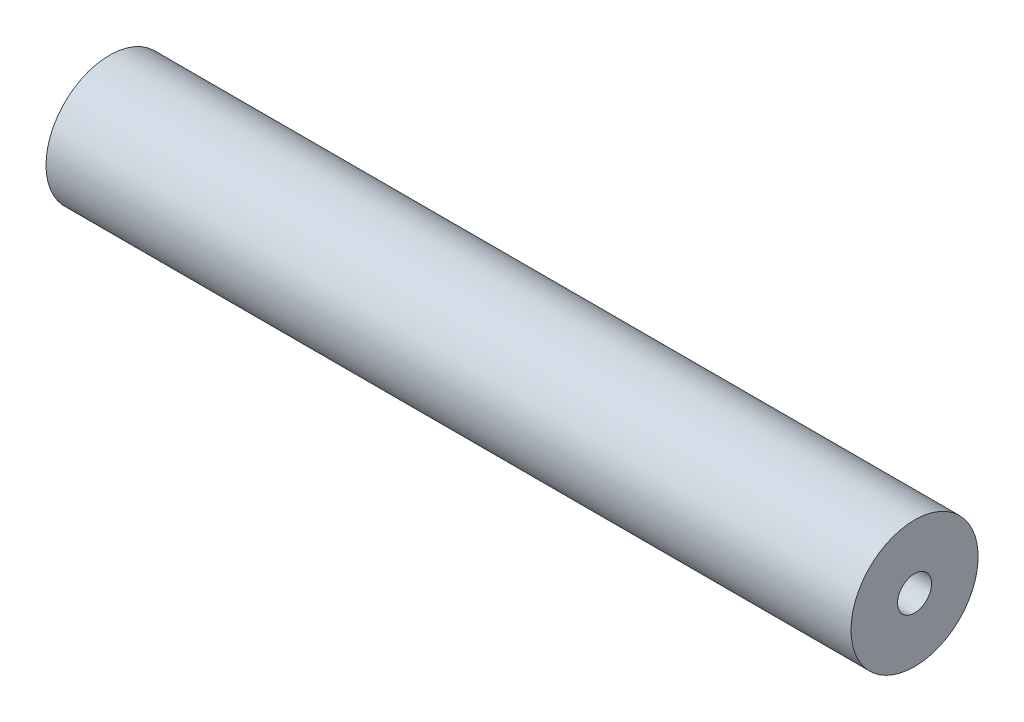
ISO-10303-21;
HEADER;
FILE_DESCRIPTION(('STEP AP214'),'2;1');
FILE_NAME('part.step','',(''),(''),'','','');
FILE_SCHEMA(('AUTOMOTIVE_DESIGN { 1 0 10303 214 1 1 1 1 }'));
ENDSEC;
DATA;
#1=APPLICATION_CONTEXT('core data for automotive mechanical design processes');
#2=APPLICATION_PROTOCOL_DEFINITION('international standard','automotive_design',2000,#1);
#3=PRODUCT_CONTEXT('',#1,'mechanical');
#4=PRODUCT('Part','Part','',(#3));
#5=PRODUCT_RELATED_PRODUCT_CATEGORY('part','',(#4));
#6=PRODUCT_DEFINITION_FORMATION('','',#4);
#7=PRODUCT_DEFINITION_CONTEXT('part definition',#1,'design');
#8=PRODUCT_DEFINITION('design','',#6,#7);
#9=PRODUCT_DEFINITION_SHAPE('','',#8);
#10=(LENGTH_UNIT() NAMED_UNIT(*) SI_UNIT(.MILLI.,.METRE.));
#11=(NAMED_UNIT(*) PLANE_ANGLE_UNIT() SI_UNIT($,.RADIAN.));
#12=(NAMED_UNIT(*) SI_UNIT($,.STERADIAN.) SOLID_ANGLE_UNIT());
#13=UNCERTAINTY_MEASURE_WITH_UNIT(LENGTH_MEASURE(1.E-05),#10,'distance_accuracy_value','');
#14=(GEOMETRIC_REPRESENTATION_CONTEXT(3) GLOBAL_UNCERTAINTY_ASSIGNED_CONTEXT((#13)) GLOBAL_UNIT_ASSIGNED_CONTEXT((#10,
#11,#12)) REPRESENTATION_CONTEXT('',''));
#15=CARTESIAN_POINT('',(0.,0.,0.));
#16=DIRECTION('',(0.,0.,1.));
#17=DIRECTION('',(1.,0.,0.));
#18=AXIS2_PLACEMENT_3D('',#15,#16,#17);
#19=CARTESIAN_POINT('',(60.325,0.,0.));
#20=DIRECTION('',(-1.,0.,0.));
#21=DIRECTION('',(0.,0.,1.));
#22=AXIS2_PLACEMENT_3D('',#19,#20,#21);
#23=CYLINDRICAL_SURFACE('',#22,9.525);
#24=CARTESIAN_POINT('',(60.325,0.,0.));
#25=DIRECTION('',(1.,0.,0.));
#26=DIRECTION('',(0.,0.,-1.));
#27=AXIS2_PLACEMENT_3D('',#24,#25,#26);
#28=CIRCLE('',#27,9.525);
#29=CARTESIAN_POINT('',(60.325,0.,9.525));
#30=VERTEX_POINT('',#29);
#31=EDGE_CURVE('E11',#30,#30,#28,.T.);
#32=CARTESIAN_POINT('',(-60.325,0.,0.));
#33=DIRECTION('',(1.,0.,0.));
#34=DIRECTION('',(0.,0.,-1.));
#35=AXIS2_PLACEMENT_3D('',#32,#33,#34);
#36=CIRCLE('',#35,9.525);
#37=CARTESIAN_POINT('',(-60.325,0.,9.525));
#38=VERTEX_POINT('',#37);
#39=EDGE_CURVE('E43',#38,#38,#36,.T.);
#40=CARTESIAN_POINT('',(60.325,0.,9.525));
#41=CARTESIAN_POINT('',(59.0682291666667,0.,9.525));
#42=CARTESIAN_POINT('',(57.8114583333333,0.,9.525));
#43=CARTESIAN_POINT('',(55.2979166666667,0.,9.525));
#44=CARTESIAN_POINT('',(54.0411458333333,0.,9.525));
#45=CARTESIAN_POINT('',(51.5276041666667,0.,9.525));
#46=CARTESIAN_POINT('',(50.2708333333333,0.,9.525));
#47=CARTESIAN_POINT('',(47.7572916666667,0.,9.525));
#48=CARTESIAN_POINT('',(46.5005208333333,0.,9.525));
#49=CARTESIAN_POINT('',(43.9869791666667,0.,9.525));
#50=CARTESIAN_POINT('',(42.7302083333333,0.,9.525));
#51=CARTESIAN_POINT('',(40.2166666666667,0.,9.525));
#52=CARTESIAN_POINT('',(38.9598958333333,0.,9.525));
#53=CARTESIAN_POINT('',(36.4463541666667,0.,9.525));
#54=CARTESIAN_POINT('',(35.1895833333333,0.,9.525));
#55=CARTESIAN_POINT('',(32.6760416666667,0.,9.525));
#56=CARTESIAN_POINT('',(31.4192708333333,0.,9.525));
#57=CARTESIAN_POINT('',(28.9057291666667,0.,9.525));
#58=CARTESIAN_POINT('',(27.6489583333333,0.,9.525));
#59=CARTESIAN_POINT('',(25.1354166666667,0.,9.525));
#60=CARTESIAN_POINT('',(23.8786458333333,0.,9.525));
#61=CARTESIAN_POINT('',(21.3651041666667,0.,9.525));
#62=CARTESIAN_POINT('',(20.1083333333333,0.,9.525));
#63=CARTESIAN_POINT('',(17.5947916666667,0.,9.525));
#64=CARTESIAN_POINT('',(16.3380208333333,0.,9.525));
#65=CARTESIAN_POINT('',(13.8244791666667,0.,9.525));
#66=CARTESIAN_POINT('',(12.5677083333333,0.,9.525));
#67=CARTESIAN_POINT('',(10.0541666666667,0.,9.525));
#68=CARTESIAN_POINT('',(8.79739583333333,0.,9.525));
#69=CARTESIAN_POINT('',(6.28385416666666,0.,9.525));
#70=CARTESIAN_POINT('',(5.02708333333333,0.,9.525));
#71=CARTESIAN_POINT('',(2.51354166666666,0.,9.525));
#72=CARTESIAN_POINT('',(1.25677083333333,0.,9.525));
#73=CARTESIAN_POINT('',(-1.25677083333333,0.,9.525));
#74=CARTESIAN_POINT('',(-2.51354166666666,0.,9.525));
#75=CARTESIAN_POINT('',(-5.02708333333332,0.,9.525));
#76=CARTESIAN_POINT('',(-6.28385416666666,0.,9.525));
#77=CARTESIAN_POINT('',(-8.79739583333333,0.,9.525));
#78=CARTESIAN_POINT('',(-10.0541666666667,0.,9.525));
#79=CARTESIAN_POINT('',(-12.5677083333333,0.,9.525));
#80=CARTESIAN_POINT('',(-13.8244791666667,0.,9.525));
#81=CARTESIAN_POINT('',(-16.3380208333333,0.,9.525));
#82=CARTESIAN_POINT('',(-17.5947916666667,0.,9.525));
#83=CARTESIAN_POINT('',(-20.1083333333333,0.,9.525));
#84=CARTESIAN_POINT('',(-21.3651041666667,0.,9.525));
#85=CARTESIAN_POINT('',(-23.8786458333333,0.,9.525));
#86=CARTESIAN_POINT('',(-25.1354166666667,0.,9.525));
#87=CARTESIAN_POINT('',(-27.6489583333333,0.,9.525));
#88=CARTESIAN_POINT('',(-28.9057291666667,0.,9.525));
#89=CARTESIAN_POINT('',(-31.4192708333333,0.,9.525));
#90=CARTESIAN_POINT('',(-32.6760416666667,0.,9.525));
#91=CARTESIAN_POINT('',(-35.1895833333333,0.,9.525));
#92=CARTESIAN_POINT('',(-36.4463541666667,0.,9.525));
#93=CARTESIAN_POINT('',(-38.9598958333333,0.,9.525));
#94=CARTESIAN_POINT('',(-40.2166666666667,0.,9.525));
#95=CARTESIAN_POINT('',(-42.7302083333333,0.,9.525));
#96=CARTESIAN_POINT('',(-43.9869791666667,0.,9.525));
#97=CARTESIAN_POINT('',(-46.5005208333333,0.,9.525));
#98=CARTESIAN_POINT('',(-47.7572916666667,0.,9.525));
#99=CARTESIAN_POINT('',(-50.2708333333333,0.,9.525));
#100=CARTESIAN_POINT('',(-51.5276041666667,0.,9.525));
#101=CARTESIAN_POINT('',(-54.0411458333333,0.,9.525));
#102=CARTESIAN_POINT('',(-55.2979166666667,0.,9.525));
#103=CARTESIAN_POINT('',(-57.8114583333333,0.,9.525));
#104=CARTESIAN_POINT('',(-59.0682291666667,0.,9.525));
#105=CARTESIAN_POINT('',(-60.325,0.,9.525));
#106=B_SPLINE_CURVE_WITH_KNOTS('',3,(#40,#41,#42,#43,#44,#45,#46,#47,#48,#49,#50,#51,#52,#53,
#54,#55,#56,#57,#58,#59,#60,#61,#62,#63,#64,#65,#66,#67,#68,#69,#70,#71,#72,#73,#74,#75,#76,#77,
#78,#79,#80,#81,#82,#83,#84,#85,#86,#87,#88,#89,#90,#91,#92,#93,#94,#95,#96,#97,#98,#99,#100,
#101,#102,#103,#104,#105),.UNSPECIFIED.,.F.,.F.,(4,2,2,2,2,2,2,2,2,2,2,2,2,2,2,2,2,2,2,2,2,2,2,
2,2,2,2,2,2,2,2,2,4),(0.,3.7703125,7.540625,11.3109375,15.08125,18.8515625,22.621875,26.3921875,
30.1625,33.9328125,37.703125,41.4734375,45.24375,49.0140625,52.784375,56.5546875,60.325,
64.0953125,67.865625,71.6359375,75.40625,79.1765625,82.946875,86.7171875,90.4875,94.2578125,
98.028125,101.7984375,105.56875,109.3390625,113.109375,116.8796875,120.65),.UNSPECIFIED.);
#107=EDGE_CURVE('BSEAM40',#30,#38,#106,.T.);
#108=ORIENTED_EDGE('',*,*,#31,.F.);
#109=ORIENTED_EDGE('',*,*,#39,.T.);
#110=ORIENTED_EDGE('',*,*,#107,.T.);
#111=ORIENTED_EDGE('',*,*,#107,.F.);
#112=EDGE_LOOP('',(#108,#110,#109,#111));
#113=FACE_BOUND('',#112,.T.);
#114=ADVANCED_FACE('F40',(#113),#23,.T.);
#115=CARTESIAN_POINT('',(60.325,0.,0.));
#116=DIRECTION('',(1.,0.,0.));
#117=DIRECTION('',(0.,0.,-1.));
#118=AXIS2_PLACEMENT_3D('',#115,#116,#117);
#119=PLANE('',#118);
#120=CARTESIAN_POINT('',(60.325,0.,0.));
#121=DIRECTION('',(1.,0.,0.));
#122=DIRECTION('',(0.,0.,-1.));
#123=AXIS2_PLACEMENT_3D('',#120,#121,#122);
#124=CIRCLE('',#123,2.5527);
#125=CARTESIAN_POINT('',(60.325,0.,-2.5527));
#126=VERTEX_POINT('',#125);
#127=EDGE_CURVE('E64',#126,#126,#124,.T.);
#128=ORIENTED_EDGE('',*,*,#127,.F.);
#129=EDGE_LOOP('',(#128));
#130=FACE_BOUND('',#129,.T.);
#131=ORIENTED_EDGE('',*,*,#31,.T.);
#132=EDGE_LOOP('',(#131));
#133=FACE_BOUND('',#132,.T.);
#134=ADVANCED_FACE('F82',(#130,#133),#119,.T.);
#135=CARTESIAN_POINT('',(-60.325,0.,0.));
#136=DIRECTION('',(1.,0.,0.));
#137=DIRECTION('',(0.,0.,-1.));
#138=AXIS2_PLACEMENT_3D('',#135,#136,#137);
#139=PLANE('',#138);
#140=CARTESIAN_POINT('',(-60.325,0.,0.));
#141=DIRECTION('',(-1.,0.,0.));
#142=DIRECTION('',(0.,0.,1.));
#143=AXIS2_PLACEMENT_3D('',#140,#141,#142);
#144=CIRCLE('',#143,2.5527);
#145=CARTESIAN_POINT('',(-60.325,0.,2.5527));
#146=VERTEX_POINT('',#145);
#147=EDGE_CURVE('E63',#146,#146,#144,.T.);
#148=ORIENTED_EDGE('',*,*,#147,.F.);
#149=EDGE_LOOP('',(#148));
#150=FACE_BOUND('',#149,.T.);
#151=ORIENTED_EDGE('',*,*,#39,.F.);
#152=EDGE_LOOP('',(#151));
#153=FACE_BOUND('',#152,.T.);
#154=ADVANCED_FACE('F79',(#150,#153),#139,.F.);
#155=CARTESIAN_POINT('',(-43.815,0.,0.));
#156=DIRECTION('',(-1.,0.,0.));
#157=DIRECTION('',(0.,0.,1.));
#158=AXIS2_PLACEMENT_3D('',#155,#156,#157);
#159=CONICAL_SURFACE('',#158,2.5527,1.02974425867665);
#160=CARTESIAN_POINT('',(-42.2811830978083,0.,0.));
#161=VERTEX_POINT('',#160);
#162=VERTEX_LOOP('',#161);
#163=FACE_BOUND('',#162,.T.);
#164=CARTESIAN_POINT('',(-43.815,0.,0.));
#165=DIRECTION('',(-1.,0.,0.));
#166=DIRECTION('',(0.,0.,1.));
#167=AXIS2_PLACEMENT_3D('',#164,#165,#166);
#168=CIRCLE('',#167,2.5527);
#169=CARTESIAN_POINT('',(-43.815,0.,2.5527));
#170=VERTEX_POINT('',#169);
#171=EDGE_CURVE('E67',#170,#170,#168,.T.);
#172=ORIENTED_EDGE('',*,*,#171,.T.);
#173=EDGE_LOOP('',(#172));
#174=FACE_BOUND('',#173,.T.);
#175=ADVANCED_FACE('F81',(#163,#174),#159,.F.);
#176=CARTESIAN_POINT('',(-60.325,0.,0.));
#177=DIRECTION('',(-1.,0.,0.));
#178=DIRECTION('',(0.,0.,1.));
#179=AXIS2_PLACEMENT_3D('',#176,#177,#178);
#180=CYLINDRICAL_SURFACE('',#179,2.5527);
#181=ORIENTED_EDGE('',*,*,#171,.F.);
#182=EDGE_LOOP('',(#181));
#183=FACE_BOUND('',#182,.T.);
#184=ORIENTED_EDGE('',*,*,#147,.T.);
#185=EDGE_LOOP('',(#184));
#186=FACE_BOUND('',#185,.T.);
#187=ADVANCED_FACE('F57',(#183,#186),#180,.F.);
#188=CARTESIAN_POINT('',(43.815,0.,0.));
#189=DIRECTION('',(1.,0.,0.));
#190=DIRECTION('',(0.,0.,-1.));
#191=AXIS2_PLACEMENT_3D('',#188,#189,#190);
#192=CONICAL_SURFACE('',#191,2.5527,1.02974425867665);
#193=CARTESIAN_POINT('',(42.2811830978083,0.,0.));
#194=VERTEX_POINT('',#193);
#195=VERTEX_LOOP('',#194);
#196=FACE_BOUND('',#195,.T.);
#197=CARTESIAN_POINT('',(43.815,0.,0.));
#198=DIRECTION('',(1.,0.,0.));
#199=DIRECTION('',(0.,0.,-1.));
#200=AXIS2_PLACEMENT_3D('',#197,#198,#199);
#201=CIRCLE('',#200,2.5527);
#202=CARTESIAN_POINT('',(43.815,0.,-2.5527));
#203=VERTEX_POINT('',#202);
#204=EDGE_CURVE('E61',#203,#203,#201,.T.);
#205=ORIENTED_EDGE('',*,*,#204,.T.);
#206=EDGE_LOOP('',(#205));
#207=FACE_BOUND('',#206,.T.);
#208=ADVANCED_FACE('F53',(#196,#207),#192,.F.);
#209=CARTESIAN_POINT('',(60.325,0.,0.));
#210=DIRECTION('',(1.,0.,0.));
#211=DIRECTION('',(0.,0.,-1.));
#212=AXIS2_PLACEMENT_3D('',#209,#210,#211);
#213=CYLINDRICAL_SURFACE('',#212,2.5527);
#214=ORIENTED_EDGE('',*,*,#204,.F.);
#215=EDGE_LOOP('',(#214));
#216=FACE_BOUND('',#215,.T.);
#217=ORIENTED_EDGE('',*,*,#127,.T.);
#218=EDGE_LOOP('',(#217));
#219=FACE_BOUND('',#218,.T.);
#220=ADVANCED_FACE('F56',(#216,#219),#213,.F.);
#221=CLOSED_SHELL('',(#114,#134,#154,#175,#187,#208,#220));
#222=MANIFOLD_SOLID_BREP('B2',#221);
#223=ADVANCED_BREP_SHAPE_REPRESENTATION('',(#18,#222),#14);
#224=SHAPE_DEFINITION_REPRESENTATION(#9,#223);
ENDSEC;
END-ISO-10303-21;
